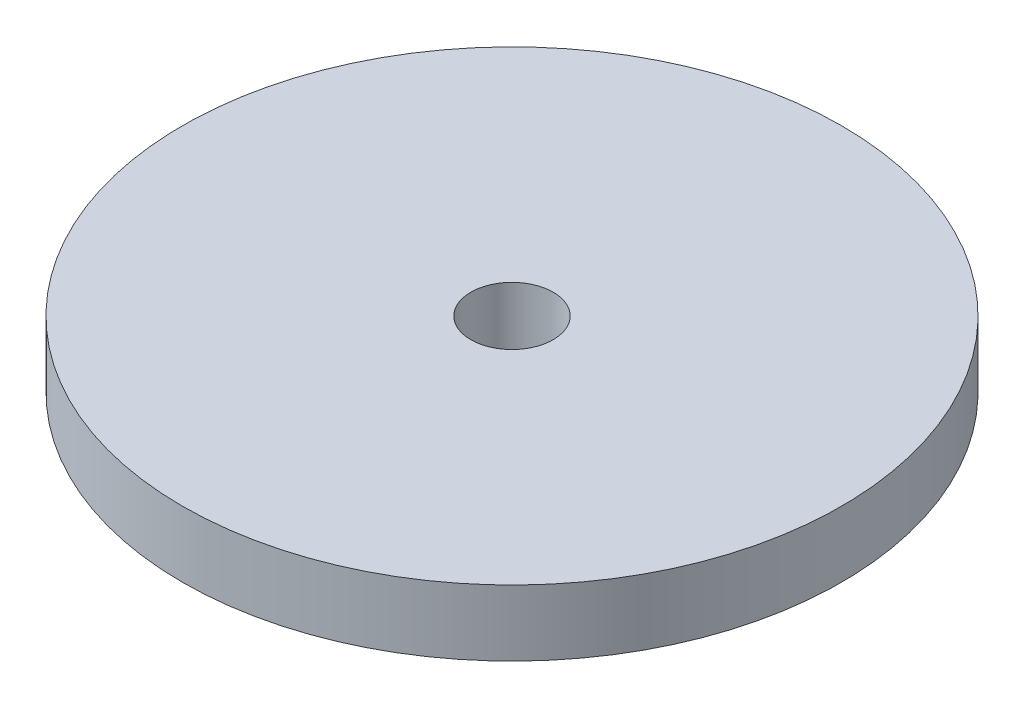
ISO-10303-21;
HEADER;
FILE_DESCRIPTION(('STEP AP214'),'2;1');
FILE_NAME('part.step','',(''),(''),'','','');
FILE_SCHEMA(('AUTOMOTIVE_DESIGN { 1 0 10303 214 1 1 1 1 }'));
ENDSEC;
DATA;
#1=APPLICATION_CONTEXT('core data for automotive mechanical design processes');
#2=APPLICATION_PROTOCOL_DEFINITION('international standard','automotive_design',2000,#1);
#3=PRODUCT_CONTEXT('',#1,'mechanical');
#4=PRODUCT('Part','Part','',(#3));
#5=PRODUCT_RELATED_PRODUCT_CATEGORY('part','',(#4));
#6=PRODUCT_DEFINITION_FORMATION('','',#4);
#7=PRODUCT_DEFINITION_CONTEXT('part definition',#1,'design');
#8=PRODUCT_DEFINITION('design','',#6,#7);
#9=PRODUCT_DEFINITION_SHAPE('','',#8);
#10=(LENGTH_UNIT() NAMED_UNIT(*) SI_UNIT(.MILLI.,.METRE.));
#11=(NAMED_UNIT(*) PLANE_ANGLE_UNIT() SI_UNIT($,.RADIAN.));
#12=(NAMED_UNIT(*) SI_UNIT($,.STERADIAN.) SOLID_ANGLE_UNIT());
#13=UNCERTAINTY_MEASURE_WITH_UNIT(LENGTH_MEASURE(1.E-05),#10,'distance_accuracy_value','');
#14=(GEOMETRIC_REPRESENTATION_CONTEXT(3) GLOBAL_UNCERTAINTY_ASSIGNED_CONTEXT((#13)) GLOBAL_UNIT_ASSIGNED_CONTEXT((#10,
#11,#12)) REPRESENTATION_CONTEXT('',''));
#15=CARTESIAN_POINT('',(0.,0.,0.));
#16=DIRECTION('',(0.,0.,1.));
#17=DIRECTION('',(1.,0.,0.));
#18=AXIS2_PLACEMENT_3D('',#15,#16,#17);
#19=CARTESIAN_POINT('',(0.,7.62,0.));
#20=DIRECTION('',(0.,-1.,0.));
#21=DIRECTION('',(0.,0.,-1.));
#22=AXIS2_PLACEMENT_3D('',#19,#20,#21);
#23=CYLINDRICAL_SURFACE('',#22,38.1);
#24=CARTESIAN_POINT('',(0.,7.62,0.));
#25=DIRECTION('',(0.,1.,0.));
#26=DIRECTION('',(0.,0.,1.));
#27=AXIS2_PLACEMENT_3D('',#24,#25,#26);
#28=CIRCLE('',#27,38.1);
#29=CARTESIAN_POINT('',(0.,7.62,-38.1));
#30=VERTEX_POINT('',#29);
#31=EDGE_CURVE('E10',#30,#30,#28,.T.);
#32=CARTESIAN_POINT('',(0.,0.,0.));
#33=DIRECTION('',(0.,1.,0.));
#34=DIRECTION('',(0.,0.,1.));
#35=AXIS2_PLACEMENT_3D('',#32,#33,#34);
#36=CIRCLE('',#35,38.1);
#37=CARTESIAN_POINT('',(0.,0.,-38.1));
#38=VERTEX_POINT('',#37);
#39=EDGE_CURVE('E35',#38,#38,#36,.T.);
#40=CARTESIAN_POINT('',(0.,7.62,-38.1));
#41=CARTESIAN_POINT('',(0.,7.540625,-38.1));
#42=CARTESIAN_POINT('',(0.,7.46125,-38.1));
#43=CARTESIAN_POINT('',(0.,7.3025,-38.1));
#44=CARTESIAN_POINT('',(0.,7.223125,-38.1));
#45=CARTESIAN_POINT('',(0.,7.064375,-38.1));
#46=CARTESIAN_POINT('',(0.,6.985,-38.1));
#47=CARTESIAN_POINT('',(0.,6.82625,-38.1));
#48=CARTESIAN_POINT('',(0.,6.746875,-38.1));
#49=CARTESIAN_POINT('',(0.,6.588125,-38.1));
#50=CARTESIAN_POINT('',(0.,6.50875,-38.1));
#51=CARTESIAN_POINT('',(0.,6.35,-38.1));
#52=CARTESIAN_POINT('',(0.,6.270625,-38.1));
#53=CARTESIAN_POINT('',(0.,6.111875,-38.1));
#54=CARTESIAN_POINT('',(0.,6.0325,-38.1));
#55=CARTESIAN_POINT('',(0.,5.87375,-38.1));
#56=CARTESIAN_POINT('',(0.,5.794375,-38.1));
#57=CARTESIAN_POINT('',(0.,5.635625,-38.1));
#58=CARTESIAN_POINT('',(0.,5.55625,-38.1));
#59=CARTESIAN_POINT('',(0.,5.3975,-38.1));
#60=CARTESIAN_POINT('',(0.,5.318125,-38.1));
#61=CARTESIAN_POINT('',(0.,5.159375,-38.1));
#62=CARTESIAN_POINT('',(0.,5.08,-38.1));
#63=CARTESIAN_POINT('',(0.,4.92125,-38.1));
#64=CARTESIAN_POINT('',(0.,4.841875,-38.1));
#65=CARTESIAN_POINT('',(0.,4.683125,-38.1));
#66=CARTESIAN_POINT('',(0.,4.60375,-38.1));
#67=CARTESIAN_POINT('',(0.,4.445,-38.1));
#68=CARTESIAN_POINT('',(0.,4.365625,-38.1));
#69=CARTESIAN_POINT('',(0.,4.206875,-38.1));
#70=CARTESIAN_POINT('',(0.,4.1275,-38.1));
#71=CARTESIAN_POINT('',(0.,3.96875,-38.1));
#72=CARTESIAN_POINT('',(0.,3.889375,-38.1));
#73=CARTESIAN_POINT('',(0.,3.730625,-38.1));
#74=CARTESIAN_POINT('',(0.,3.65125,-38.1));
#75=CARTESIAN_POINT('',(0.,3.4925,-38.1));
#76=CARTESIAN_POINT('',(0.,3.413125,-38.1));
#77=CARTESIAN_POINT('',(0.,3.254375,-38.1));
#78=CARTESIAN_POINT('',(0.,3.175,-38.1));
#79=CARTESIAN_POINT('',(0.,3.01625,-38.1));
#80=CARTESIAN_POINT('',(0.,2.936875,-38.1));
#81=CARTESIAN_POINT('',(0.,2.778125,-38.1));
#82=CARTESIAN_POINT('',(0.,2.69875,-38.1));
#83=CARTESIAN_POINT('',(0.,2.54,-38.1));
#84=CARTESIAN_POINT('',(0.,2.460625,-38.1));
#85=CARTESIAN_POINT('',(0.,2.301875,-38.1));
#86=CARTESIAN_POINT('',(0.,2.2225,-38.1));
#87=CARTESIAN_POINT('',(0.,2.06375,-38.1));
#88=CARTESIAN_POINT('',(0.,1.984375,-38.1));
#89=CARTESIAN_POINT('',(0.,1.825625,-38.1));
#90=CARTESIAN_POINT('',(0.,1.74625,-38.1));
#91=CARTESIAN_POINT('',(0.,1.5875,-38.1));
#92=CARTESIAN_POINT('',(0.,1.508125,-38.1));
#93=CARTESIAN_POINT('',(0.,1.349375,-38.1));
#94=CARTESIAN_POINT('',(0.,1.27,-38.1));
#95=CARTESIAN_POINT('',(0.,1.11125,-38.1));
#96=CARTESIAN_POINT('',(0.,1.031875,-38.1));
#97=CARTESIAN_POINT('',(0.,0.873125,-38.1));
#98=CARTESIAN_POINT('',(0.,0.79375,-38.1));
#99=CARTESIAN_POINT('',(0.,0.635,-38.1));
#100=CARTESIAN_POINT('',(0.,0.555625,-38.1));
#101=CARTESIAN_POINT('',(0.,0.396875,-38.1));
#102=CARTESIAN_POINT('',(0.,0.3175,-38.1));
#103=CARTESIAN_POINT('',(0.,0.15875,-38.1));
#104=CARTESIAN_POINT('',(0.,0.0793749999999999,-38.1));
#105=CARTESIAN_POINT('',(0.,0.,-38.1));
#106=B_SPLINE_CURVE_WITH_KNOTS('',3,(#40,#41,#42,#43,#44,#45,#46,#47,#48,#49,#50,#51,#52,#53,
#54,#55,#56,#57,#58,#59,#60,#61,#62,#63,#64,#65,#66,#67,#68,#69,#70,#71,#72,#73,#74,#75,#76,#77,
#78,#79,#80,#81,#82,#83,#84,#85,#86,#87,#88,#89,#90,#91,#92,#93,#94,#95,#96,#97,#98,#99,#100,
#101,#102,#103,#104,#105),.UNSPECIFIED.,.F.,.F.,(4,2,2,2,2,2,2,2,2,2,2,2,2,2,2,2,2,2,2,2,2,2,2,
2,2,2,2,2,2,2,2,2,4),(0.,0.238125,0.47625,0.714375000000001,0.9525,1.190625,1.42875,1.666875,
1.905,2.143125,2.38125,2.619375,2.8575,3.095625,3.33375,3.571875,3.81,4.048125,4.28625,4.524375,
4.7625,5.000625,5.23875,5.476875,5.715,5.953125,6.19125,6.429375,6.6675,6.905625,7.14375,
7.381875,7.62),.UNSPECIFIED.);
#107=EDGE_CURVE('BSEAM32',#30,#38,#106,.T.);
#108=ORIENTED_EDGE('',*,*,#31,.F.);
#109=ORIENTED_EDGE('',*,*,#39,.T.);
#110=ORIENTED_EDGE('',*,*,#107,.T.);
#111=ORIENTED_EDGE('',*,*,#107,.F.);
#112=EDGE_LOOP('',(#108,#110,#109,#111));
#113=FACE_BOUND('',#112,.T.);
#114=ADVANCED_FACE('F32',(#113),#23,.T.);
#115=CARTESIAN_POINT('',(0.,7.62,0.));
#116=DIRECTION('',(0.,1.,0.));
#117=DIRECTION('',(0.,0.,1.));
#118=AXIS2_PLACEMENT_3D('',#115,#116,#117);
#119=PLANE('',#118);
#120=CARTESIAN_POINT('',(0.,7.62,0.));
#121=DIRECTION('',(0.,1.,0.));
#122=DIRECTION('',(0.,0.,1.));
#123=AXIS2_PLACEMENT_3D('',#120,#121,#122);
#124=CIRCLE('',#123,4.7625);
#125=CARTESIAN_POINT('',(0.,7.62,4.7625));
#126=VERTEX_POINT('',#125);
#127=EDGE_CURVE('E44',#126,#126,#124,.T.);
#128=ORIENTED_EDGE('',*,*,#127,.F.);
#129=EDGE_LOOP('',(#128));
#130=FACE_BOUND('',#129,.T.);
#131=ORIENTED_EDGE('',*,*,#31,.T.);
#132=EDGE_LOOP('',(#131));
#133=FACE_BOUND('',#132,.T.);
#134=ADVANCED_FACE('F59',(#130,#133),#119,.T.);
#135=CARTESIAN_POINT('',(0.,0.,0.));
#136=DIRECTION('',(0.,1.,0.));
#137=DIRECTION('',(0.,0.,1.));
#138=AXIS2_PLACEMENT_3D('',#135,#136,#137);
#139=PLANE('',#138);
#140=CARTESIAN_POINT('',(0.,0.,0.));
#141=DIRECTION('',(0.,1.,0.));
#142=DIRECTION('',(0.,0.,1.));
#143=AXIS2_PLACEMENT_3D('',#140,#141,#142);
#144=CIRCLE('',#143,4.7625);
#145=CARTESIAN_POINT('',(0.,0.,4.7625));
#146=VERTEX_POINT('',#145);
#147=EDGE_CURVE('E42',#146,#146,#144,.T.);
#148=ORIENTED_EDGE('',*,*,#147,.T.);
#149=EDGE_LOOP('',(#148));
#150=FACE_BOUND('',#149,.T.);
#151=ORIENTED_EDGE('',*,*,#39,.F.);
#152=EDGE_LOOP('',(#151));
#153=FACE_BOUND('',#152,.T.);
#154=ADVANCED_FACE('F50',(#150,#153),#139,.F.);
#155=CARTESIAN_POINT('',(0.,0.,0.));
#156=DIRECTION('',(0.,1.,0.));
#157=DIRECTION('',(0.,0.,1.));
#158=AXIS2_PLACEMENT_3D('',#155,#156,#157);
#159=CYLINDRICAL_SURFACE('',#158,4.7625);
#160=CARTESIAN_POINT('',(0.,0.,4.7625));
#161=CARTESIAN_POINT('',(0.,0.0793749999999998,4.7625));
#162=CARTESIAN_POINT('',(0.,0.15875,4.7625));
#163=CARTESIAN_POINT('',(0.,0.3175,4.7625));
#164=CARTESIAN_POINT('',(0.,0.396875,4.7625));
#165=CARTESIAN_POINT('',(0.,0.555625,4.7625));
#166=CARTESIAN_POINT('',(0.,0.635,4.7625));
#167=CARTESIAN_POINT('',(0.,0.79375,4.7625));
#168=CARTESIAN_POINT('',(0.,0.873125,4.7625));
#169=CARTESIAN_POINT('',(0.,1.031875,4.7625));
#170=CARTESIAN_POINT('',(0.,1.11125,4.7625));
#171=CARTESIAN_POINT('',(0.,1.27,4.7625));
#172=CARTESIAN_POINT('',(0.,1.349375,4.7625));
#173=CARTESIAN_POINT('',(0.,1.508125,4.7625));
#174=CARTESIAN_POINT('',(0.,1.5875,4.7625));
#175=CARTESIAN_POINT('',(0.,1.74625,4.7625));
#176=CARTESIAN_POINT('',(0.,1.825625,4.7625));
#177=CARTESIAN_POINT('',(0.,1.984375,4.7625));
#178=CARTESIAN_POINT('',(0.,2.06375,4.7625));
#179=CARTESIAN_POINT('',(0.,2.2225,4.7625));
#180=CARTESIAN_POINT('',(0.,2.301875,4.7625));
#181=CARTESIAN_POINT('',(0.,2.460625,4.7625));
#182=CARTESIAN_POINT('',(0.,2.54,4.7625));
#183=CARTESIAN_POINT('',(0.,2.69875,4.7625));
#184=CARTESIAN_POINT('',(0.,2.778125,4.7625));
#185=CARTESIAN_POINT('',(0.,2.936875,4.7625));
#186=CARTESIAN_POINT('',(0.,3.01625,4.7625));
#187=CARTESIAN_POINT('',(0.,3.175,4.7625));
#188=CARTESIAN_POINT('',(0.,3.254375,4.7625));
#189=CARTESIAN_POINT('',(0.,3.413125,4.7625));
#190=CARTESIAN_POINT('',(0.,3.4925,4.7625));
#191=CARTESIAN_POINT('',(0.,3.65125,4.7625));
#192=CARTESIAN_POINT('',(0.,3.730625,4.7625));
#193=CARTESIAN_POINT('',(0.,3.889375,4.7625));
#194=CARTESIAN_POINT('',(0.,3.96875,4.7625));
#195=CARTESIAN_POINT('',(0.,4.1275,4.7625));
#196=CARTESIAN_POINT('',(0.,4.206875,4.7625));
#197=CARTESIAN_POINT('',(0.,4.365625,4.7625));
#198=CARTESIAN_POINT('',(0.,4.445,4.7625));
#199=CARTESIAN_POINT('',(0.,4.60375,4.7625));
#200=CARTESIAN_POINT('',(0.,4.683125,4.7625));
#201=CARTESIAN_POINT('',(0.,4.841875,4.7625));
#202=CARTESIAN_POINT('',(0.,4.92125,4.7625));
#203=CARTESIAN_POINT('',(0.,5.08,4.7625));
#204=CARTESIAN_POINT('',(0.,5.159375,4.7625));
#205=CARTESIAN_POINT('',(0.,5.318125,4.7625));
#206=CARTESIAN_POINT('',(0.,5.3975,4.7625));
#207=CARTESIAN_POINT('',(0.,5.55625,4.7625));
#208=CARTESIAN_POINT('',(0.,5.635625,4.7625));
#209=CARTESIAN_POINT('',(0.,5.794375,4.7625));
#210=CARTESIAN_POINT('',(0.,5.87375,4.7625));
#211=CARTESIAN_POINT('',(0.,6.0325,4.7625));
#212=CARTESIAN_POINT('',(0.,6.111875,4.7625));
#213=CARTESIAN_POINT('',(0.,6.270625,4.7625));
#214=CARTESIAN_POINT('',(0.,6.35,4.7625));
#215=CARTESIAN_POINT('',(0.,6.50875,4.7625));
#216=CARTESIAN_POINT('',(0.,6.588125,4.7625));
#217=CARTESIAN_POINT('',(0.,6.746875,4.7625));
#218=CARTESIAN_POINT('',(0.,6.82625,4.7625));
#219=CARTESIAN_POINT('',(0.,6.985,4.7625));
#220=CARTESIAN_POINT('',(0.,7.064375,4.7625));
#221=CARTESIAN_POINT('',(0.,7.223125,4.7625));
#222=CARTESIAN_POINT('',(0.,7.3025,4.7625));
#223=CARTESIAN_POINT('',(0.,7.46125,4.7625));
#224=CARTESIAN_POINT('',(0.,7.540625,4.7625));
#225=CARTESIAN_POINT('',(0.,7.62,4.7625));
#226=B_SPLINE_CURVE_WITH_KNOTS('',3,(#160,#161,#162,#163,#164,#165,#166,#167,#168,#169,#170,
#171,#172,#173,#174,#175,#176,#177,#178,#179,#180,#181,#182,#183,#184,#185,#186,#187,#188,#189,
#190,#191,#192,#193,#194,#195,#196,#197,#198,#199,#200,#201,#202,#203,#204,#205,#206,#207,#208,
#209,#210,#211,#212,#213,#214,#215,#216,#217,#218,#219,#220,#221,#222,#223,#224,#225),
.UNSPECIFIED.,.F.,.F.,(4,2,2,2,2,2,2,2,2,2,2,2,2,2,2,2,2,2,2,2,2,2,2,2,2,2,2,2,2,2,2,2,4),(0.,
0.238125,0.47625,0.714375,0.9525,1.190625,1.42875,1.666875,1.905,2.143125,2.38125,2.619375,
2.8575,3.095625,3.33375,3.571875,3.81,4.048125,4.28625,4.524375,4.7625,5.000625,5.23875,
5.476875,5.715,5.953125,6.19125,6.429375,6.6675,6.905625,7.14375,7.381875,7.62),.UNSPECIFIED.);
#227=EDGE_CURVE('BSEAM53',#146,#126,#226,.T.);
#228=ORIENTED_EDGE('',*,*,#147,.F.);
#229=ORIENTED_EDGE('',*,*,#127,.T.);
#230=ORIENTED_EDGE('',*,*,#227,.T.);
#231=ORIENTED_EDGE('',*,*,#227,.F.);
#232=EDGE_LOOP('',(#228,#230,#229,#231));
#233=FACE_BOUND('',#232,.T.);
#234=ADVANCED_FACE('F53',(#233),#159,.F.);
#235=CLOSED_SHELL('',(#114,#134,#154,#234));
#236=MANIFOLD_SOLID_BREP('B2',#235);
#237=ADVANCED_BREP_SHAPE_REPRESENTATION('',(#18,#236),#14);
#238=SHAPE_DEFINITION_REPRESENTATION(#9,#237);
ENDSEC;
END-ISO-10303-21;
